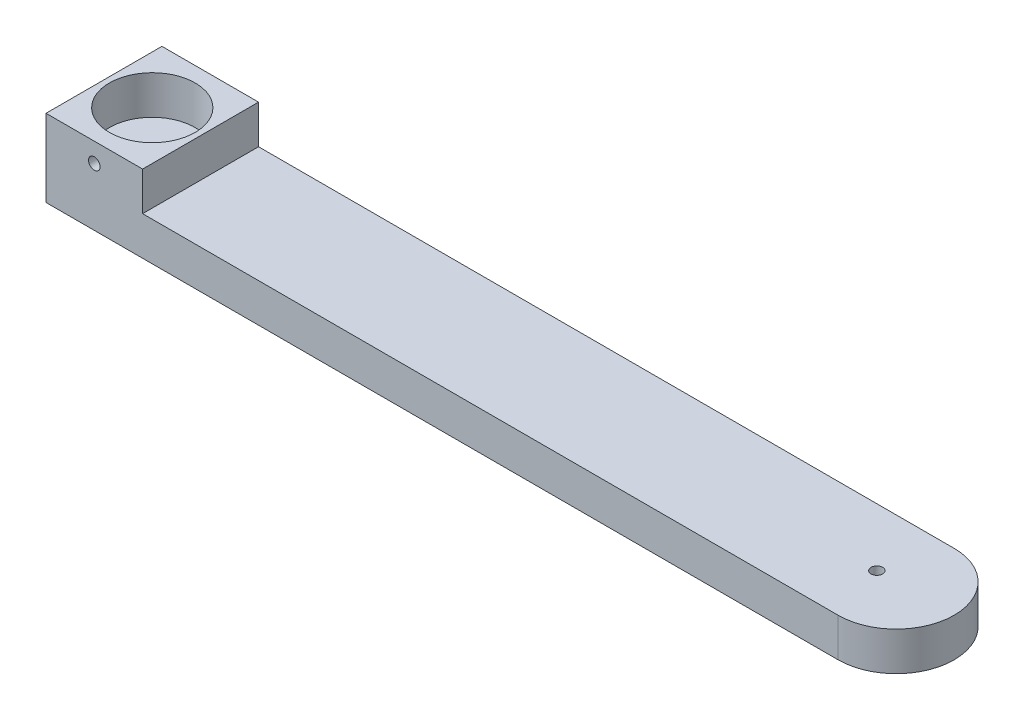
ISO-10303-21;
HEADER;
FILE_DESCRIPTION(('STEP AP214'),'2;1');
FILE_NAME('part.step','',(''),(''),'','','');
FILE_SCHEMA(('AUTOMOTIVE_DESIGN { 1 0 10303 214 1 1 1 1 }'));
ENDSEC;
DATA;
#1=APPLICATION_CONTEXT('core data for automotive mechanical design processes');
#2=APPLICATION_PROTOCOL_DEFINITION('international standard','automotive_design',2000,#1);
#3=PRODUCT_CONTEXT('',#1,'mechanical');
#4=PRODUCT('Part','Part','',(#3));
#5=PRODUCT_RELATED_PRODUCT_CATEGORY('part','',(#4));
#6=PRODUCT_DEFINITION_FORMATION('','',#4);
#7=PRODUCT_DEFINITION_CONTEXT('part definition',#1,'design');
#8=PRODUCT_DEFINITION('design','',#6,#7);
#9=PRODUCT_DEFINITION_SHAPE('','',#8);
#10=(LENGTH_UNIT() NAMED_UNIT(*) SI_UNIT(.MILLI.,.METRE.));
#11=(NAMED_UNIT(*) PLANE_ANGLE_UNIT() SI_UNIT($,.RADIAN.));
#12=(NAMED_UNIT(*) SI_UNIT($,.STERADIAN.) SOLID_ANGLE_UNIT());
#13=UNCERTAINTY_MEASURE_WITH_UNIT(LENGTH_MEASURE(1.E-05),#10,'distance_accuracy_value','');
#14=(GEOMETRIC_REPRESENTATION_CONTEXT(3) GLOBAL_UNCERTAINTY_ASSIGNED_CONTEXT((#13)) GLOBAL_UNIT_ASSIGNED_CONTEXT((#10,
#11,#12)) REPRESENTATION_CONTEXT('',''));
#15=CARTESIAN_POINT('',(0.,0.,0.));
#16=DIRECTION('',(0.,0.,1.));
#17=DIRECTION('',(1.,0.,0.));
#18=AXIS2_PLACEMENT_3D('',#15,#16,#17);
#19=CARTESIAN_POINT('',(0.,10.,15.));
#20=DIRECTION('',(0.,0.,-1.));
#21=DIRECTION('',(-1.,0.,0.));
#22=AXIS2_PLACEMENT_3D('',#19,#20,#21);
#23=PLANE('',#22);
#24=CARTESIAN_POINT('',(-97.5,15.,15.));
#25=DIRECTION('',(0.,0.,1.));
#26=DIRECTION('',(1.,0.,0.));
#27=AXIS2_PLACEMENT_3D('',#24,#25,#26);
#28=CIRCLE('',#27,1.5);
#29=CARTESIAN_POINT('',(-96.,15.,15.));
#30=VERTEX_POINT('',#29);
#31=EDGE_CURVE('E138',#30,#30,#28,.T.);
#32=ORIENTED_EDGE('',*,*,#31,.F.);
#33=EDGE_LOOP('',(#32));
#34=FACE_BOUND('',#33,.T.);
#35=DIRECTION('',(1.,0.,0.));
#36=VECTOR('',#35,1.);
#37=CARTESIAN_POINT('',(0.,0.,15.));
#38=LINE('',#37,#36);
#39=CARTESIAN_POINT('',(-110.,0.,15.));
#40=VERTEX_POINT('',#39);
#41=CARTESIAN_POINT('',(95.,0.,15.));
#42=VERTEX_POINT('',#41);
#43=EDGE_CURVE('E91',#40,#42,#38,.T.);
#44=ORIENTED_EDGE('',*,*,#43,.T.);
#45=DIRECTION('',(0.,-1.,0.));
#46=VECTOR('',#45,1.);
#47=CARTESIAN_POINT('',(95.,10.,15.));
#48=LINE('',#47,#46);
#49=CARTESIAN_POINT('',(95.,10.,15.));
#50=VERTEX_POINT('',#49);
#51=EDGE_CURVE('E11',#50,#42,#48,.T.);
#52=ORIENTED_EDGE('',*,*,#51,.F.);
#53=DIRECTION('',(1.,0.,0.));
#54=VECTOR('',#53,1.);
#55=CARTESIAN_POINT('',(0.,10.,15.));
#56=LINE('',#55,#54);
#57=CARTESIAN_POINT('',(-85.,10.,15.));
#58=VERTEX_POINT('',#57);
#59=EDGE_CURVE('E116',#58,#50,#56,.T.);
#60=ORIENTED_EDGE('',*,*,#59,.F.);
#61=DIRECTION('',(0.,-1.,0.));
#62=VECTOR('',#61,1.);
#63=CARTESIAN_POINT('',(-85.,20.,15.));
#64=LINE('',#63,#62);
#65=CARTESIAN_POINT('',(-85.,20.,15.));
#66=VERTEX_POINT('',#65);
#67=EDGE_CURVE('E110',#66,#58,#64,.T.);
#68=ORIENTED_EDGE('',*,*,#67,.F.);
#69=DIRECTION('',(1.,0.,0.));
#70=VECTOR('',#69,1.);
#71=CARTESIAN_POINT('',(0.,20.,15.));
#72=LINE('',#71,#70);
#73=CARTESIAN_POINT('',(-110.,20.,15.));
#74=VERTEX_POINT('',#73);
#75=EDGE_CURVE('E94',#74,#66,#72,.T.);
#76=ORIENTED_EDGE('',*,*,#75,.F.);
#77=DIRECTION('',(0.,-1.,0.));
#78=VECTOR('',#77,1.);
#79=CARTESIAN_POINT('',(-110.,10.,15.));
#80=LINE('',#79,#78);
#81=EDGE_CURVE('E88',#74,#40,#80,.T.);
#82=ORIENTED_EDGE('',*,*,#81,.T.);
#83=EDGE_LOOP('',(#44,#52,#60,#68,#76,#82));
#84=FACE_BOUND('',#83,.T.);
#85=ADVANCED_FACE('F44',(#34,#84),#23,.F.);
#86=CARTESIAN_POINT('',(95.,10.,0.));
#87=DIRECTION('',(0.,-1.,0.));
#88=DIRECTION('',(0.,0.,-1.));
#89=AXIS2_PLACEMENT_3D('',#86,#87,#88);
#90=CYLINDRICAL_SURFACE('',#89,15.);
#91=CARTESIAN_POINT('',(95.,0.,0.));
#92=DIRECTION('',(0.,1.,0.));
#93=DIRECTION('',(0.,0.,1.));
#94=AXIS2_PLACEMENT_3D('',#91,#92,#93);
#95=CIRCLE('',#94,15.);
#96=CARTESIAN_POINT('',(95.,0.,-15.));
#97=VERTEX_POINT('',#96);
#98=EDGE_CURVE('E108',#42,#97,#95,.T.);
#99=ORIENTED_EDGE('',*,*,#98,.T.);
#100=DIRECTION('',(0.,-1.,0.));
#101=VECTOR('',#100,1.);
#102=CARTESIAN_POINT('',(95.,10.,-15.));
#103=LINE('',#102,#101);
#104=CARTESIAN_POINT('',(95.,10.,-15.));
#105=VERTEX_POINT('',#104);
#106=EDGE_CURVE('E53',#105,#97,#103,.T.);
#107=ORIENTED_EDGE('',*,*,#106,.F.);
#108=CARTESIAN_POINT('',(95.,10.,0.));
#109=DIRECTION('',(0.,1.,0.));
#110=DIRECTION('',(0.,0.,1.));
#111=AXIS2_PLACEMENT_3D('',#108,#109,#110);
#112=CIRCLE('',#111,15.);
#113=EDGE_CURVE('E121',#50,#105,#112,.T.);
#114=ORIENTED_EDGE('',*,*,#113,.F.);
#115=ORIENTED_EDGE('',*,*,#51,.T.);
#116=EDGE_LOOP('',(#99,#107,#114,#115));
#117=FACE_BOUND('',#116,.T.);
#118=ADVANCED_FACE('F167',(#117),#90,.T.);
#119=CARTESIAN_POINT('',(0.,10.,-15.));
#120=DIRECTION('',(0.,0.,-1.));
#121=DIRECTION('',(-1.,0.,0.));
#122=AXIS2_PLACEMENT_3D('',#119,#120,#121);
#123=PLANE('',#122);
#124=CARTESIAN_POINT('',(90.,3.,-15.));
#125=DIRECTION('',(0.,0.,-1.));
#126=DIRECTION('',(-1.,0.,0.));
#127=AXIS2_PLACEMENT_3D('',#124,#125,#126);
#128=CIRCLE('',#127,1.5);
#129=CARTESIAN_POINT('',(88.5,3.,-15.));
#130=VERTEX_POINT('',#129);
#131=EDGE_CURVE('E408',#130,#130,#128,.T.);
#132=ORIENTED_EDGE('',*,*,#131,.F.);
#133=EDGE_LOOP('',(#132));
#134=FACE_BOUND('',#133,.T.);
#135=DIRECTION('',(1.,0.,0.));
#136=VECTOR('',#135,1.);
#137=CARTESIAN_POINT('',(0.,0.,-15.));
#138=LINE('',#137,#136);
#139=CARTESIAN_POINT('',(-110.,0.,-15.));
#140=VERTEX_POINT('',#139);
#141=EDGE_CURVE('E117',#140,#97,#138,.T.);
#142=ORIENTED_EDGE('',*,*,#141,.F.);
#143=DIRECTION('',(0.,-1.,0.));
#144=VECTOR('',#143,1.);
#145=CARTESIAN_POINT('',(-110.,10.,-15.));
#146=LINE('',#145,#144);
#147=CARTESIAN_POINT('',(-110.,20.,-15.));
#148=VERTEX_POINT('',#147);
#149=EDGE_CURVE('E100',#148,#140,#146,.T.);
#150=ORIENTED_EDGE('',*,*,#149,.F.);
#151=DIRECTION('',(-1.,0.,0.));
#152=VECTOR('',#151,1.);
#153=CARTESIAN_POINT('',(0.,20.,-15.));
#154=LINE('',#153,#152);
#155=CARTESIAN_POINT('',(-85.,20.,-15.));
#156=VERTEX_POINT('',#155);
#157=EDGE_CURVE('E196',#156,#148,#154,.T.);
#158=ORIENTED_EDGE('',*,*,#157,.F.);
#159=DIRECTION('',(0.,-1.,0.));
#160=VECTOR('',#159,1.);
#161=CARTESIAN_POINT('',(-85.,20.,-15.));
#162=LINE('',#161,#160);
#163=CARTESIAN_POINT('',(-85.,10.,-15.));
#164=VERTEX_POINT('',#163);
#165=EDGE_CURVE('E203',#156,#164,#162,.T.);
#166=ORIENTED_EDGE('',*,*,#165,.T.);
#167=DIRECTION('',(1.,0.,0.));
#168=VECTOR('',#167,1.);
#169=CARTESIAN_POINT('',(0.,10.,-15.));
#170=LINE('',#169,#168);
#171=EDGE_CURVE('E69',#164,#105,#170,.T.);
#172=ORIENTED_EDGE('',*,*,#171,.T.);
#173=ORIENTED_EDGE('',*,*,#106,.T.);
#174=EDGE_LOOP('',(#142,#150,#158,#166,#172,#173));
#175=FACE_BOUND('',#174,.T.);
#176=ADVANCED_FACE('F172',(#134,#175),#123,.T.);
#177=CARTESIAN_POINT('',(-110.,10.,0.));
#178=DIRECTION('',(-1.,0.,0.));
#179=DIRECTION('',(0.,0.,1.));
#180=AXIS2_PLACEMENT_3D('',#177,#178,#179);
#181=PLANE('',#180);
#182=DIRECTION('',(0.,0.,-1.));
#183=VECTOR('',#182,1.);
#184=CARTESIAN_POINT('',(-110.,0.,0.));
#185=LINE('',#184,#183);
#186=EDGE_CURVE('E106',#40,#140,#185,.T.);
#187=ORIENTED_EDGE('',*,*,#186,.F.);
#188=ORIENTED_EDGE('',*,*,#81,.F.);
#189=DIRECTION('',(0.,0.,1.));
#190=VECTOR('',#189,1.);
#191=CARTESIAN_POINT('',(-110.,20.,0.));
#192=LINE('',#191,#190);
#193=EDGE_CURVE('E200',#148,#74,#192,.T.);
#194=ORIENTED_EDGE('',*,*,#193,.F.);
#195=ORIENTED_EDGE('',*,*,#149,.T.);
#196=EDGE_LOOP('',(#187,#188,#194,#195));
#197=FACE_BOUND('',#196,.T.);
#198=ADVANCED_FACE('F112',(#197),#181,.T.);
#199=CARTESIAN_POINT('',(0.,10.,0.));
#200=DIRECTION('',(0.,1.,0.));
#201=DIRECTION('',(0.,0.,1.));
#202=AXIS2_PLACEMENT_3D('',#199,#200,#201);
#203=PLANE('',#202);
#204=CARTESIAN_POINT('',(90.,10.,0.));
#205=DIRECTION('',(0.,1.,0.));
#206=DIRECTION('',(0.,0.,1.));
#207=AXIS2_PLACEMENT_3D('',#204,#205,#206);
#208=CIRCLE('',#207,1.5);
#209=CARTESIAN_POINT('',(90.,10.,1.5));
#210=VERTEX_POINT('',#209);
#211=EDGE_CURVE('E47',#210,#210,#208,.T.);
#212=ORIENTED_EDGE('',*,*,#211,.F.);
#213=EDGE_LOOP('',(#212));
#214=FACE_BOUND('',#213,.T.);
#215=DIRECTION('',(0.,0.,-1.));
#216=VECTOR('',#215,1.);
#217=CARTESIAN_POINT('',(-85.,10.,0.));
#218=LINE('',#217,#216);
#219=EDGE_CURVE('E61',#58,#164,#218,.T.);
#220=ORIENTED_EDGE('',*,*,#219,.F.);
#221=ORIENTED_EDGE('',*,*,#59,.T.);
#222=ORIENTED_EDGE('',*,*,#113,.T.);
#223=ORIENTED_EDGE('',*,*,#171,.F.);
#224=EDGE_LOOP('',(#220,#221,#222,#223));
#225=FACE_BOUND('',#224,.T.);
#226=ADVANCED_FACE('F163',(#214,#225),#203,.T.);
#227=CARTESIAN_POINT('',(0.,0.,0.));
#228=DIRECTION('',(0.,1.,0.));
#229=DIRECTION('',(0.,0.,1.));
#230=AXIS2_PLACEMENT_3D('',#227,#228,#229);
#231=PLANE('',#230);
#232=CARTESIAN_POINT('',(90.,0.,0.));
#233=DIRECTION('',(0.,1.,0.));
#234=DIRECTION('',(0.,0.,1.));
#235=AXIS2_PLACEMENT_3D('',#232,#233,#234);
#236=CIRCLE('',#235,4.00000000000001);
#237=CARTESIAN_POINT('',(90.,0.,4.00000000000001));
#238=VERTEX_POINT('',#237);
#239=EDGE_CURVE('E182',#238,#238,#236,.T.);
#240=ORIENTED_EDGE('',*,*,#239,.T.);
#241=EDGE_LOOP('',(#240));
#242=FACE_BOUND('',#241,.T.);
#243=ORIENTED_EDGE('',*,*,#43,.F.);
#244=ORIENTED_EDGE('',*,*,#186,.T.);
#245=ORIENTED_EDGE('',*,*,#141,.T.);
#246=ORIENTED_EDGE('',*,*,#98,.F.);
#247=EDGE_LOOP('',(#243,#244,#245,#246));
#248=FACE_BOUND('',#247,.T.);
#249=ADVANCED_FACE('F104',(#242,#248),#231,.F.);
#250=CARTESIAN_POINT('',(-85.,20.,0.));
#251=DIRECTION('',(-1.,0.,0.));
#252=DIRECTION('',(0.,0.,1.));
#253=AXIS2_PLACEMENT_3D('',#250,#251,#252);
#254=PLANE('',#253);
#255=ORIENTED_EDGE('',*,*,#219,.T.);
#256=ORIENTED_EDGE('',*,*,#165,.F.);
#257=DIRECTION('',(0.,0.,-1.));
#258=VECTOR('',#257,1.);
#259=CARTESIAN_POINT('',(-85.,20.,0.));
#260=LINE('',#259,#258);
#261=EDGE_CURVE('E192',#66,#156,#260,.T.);
#262=ORIENTED_EDGE('',*,*,#261,.F.);
#263=ORIENTED_EDGE('',*,*,#67,.T.);
#264=EDGE_LOOP('',(#255,#256,#262,#263));
#265=FACE_BOUND('',#264,.T.);
#266=ADVANCED_FACE('F155',(#265),#254,.F.);
#267=CARTESIAN_POINT('',(-97.5,20.,0.));
#268=DIRECTION('',(0.,-1.,0.));
#269=DIRECTION('',(0.,0.,-1.));
#270=AXIS2_PLACEMENT_3D('',#267,#268,#269);
#271=CYLINDRICAL_SURFACE('',#270,11.1);
#272=CARTESIAN_POINT('',(-96.,15.,10.998181667894));
#273=CARTESIAN_POINT('',(-96.0000035281599,14.9161580954853,10.9981829557639));
#274=CARTESIAN_POINT('',(-96.00705320464,14.8322652184173,10.9991507505894));
#275=CARTESIAN_POINT('',(-96.0350619505974,14.6668183546661,11.0029154546431));
#276=CARTESIAN_POINT('',(-96.0560351833152,14.5852668378615,11.0057142263249));
#277=CARTESIAN_POINT('',(-96.1112578524538,14.4269218129182,11.0128182238988));
#278=CARTESIAN_POINT('',(-96.1454978267286,14.3501249588183,11.0171223759064));
#279=CARTESIAN_POINT('',(-96.2262609525471,14.203379937368,11.0267508792424));
#280=CARTESIAN_POINT('',(-96.2727821618724,14.1334306894973,11.0320750692203));
#281=CARTESIAN_POINT('',(-96.3771116535308,14.0018974483291,11.0431825945482));
#282=CARTESIAN_POINT('',(-96.4349841207836,13.9403645699134,11.0489684243663));
#283=CARTESIAN_POINT('',(-96.5602349623021,13.8278528521415,11.0603249492234));
#284=CARTESIAN_POINT('',(-96.6276138278358,13.7768745585574,11.0658956331254));
#285=CARTESIAN_POINT('',(-96.7702886995094,13.6867335573127,11.0762199772553));
#286=CARTESIAN_POINT('',(-96.845614401394,13.6476174476807,11.0809703845469));
#287=CARTESIAN_POINT('',(-97.0018409378437,13.5826098531584,11.0890914287869));
#288=CARTESIAN_POINT('',(-97.0827415318133,13.556717797963,11.0924621252358));
#289=CARTESIAN_POINT('',(-97.2472969605793,13.5190469436924,11.0974263799507));
#290=CARTESIAN_POINT('',(-97.3309319485008,13.5071828855879,11.0990306698954));
#291=CARTESIAN_POINT('',(-97.4990200643834,13.4976403780351,11.1003180521346));
#292=CARTESIAN_POINT('',(-97.5834731548711,13.4999612818767,11.1000012320149));
#293=CARTESIAN_POINT('',(-97.7502194700646,13.5186548909547,11.0974907319258));
#294=CARTESIAN_POINT('',(-97.8325231861168,13.5349358910085,11.0953093010515));
#295=CARTESIAN_POINT('',(-97.9932194636933,13.5809439526343,11.0893283808514));
#296=CARTESIAN_POINT('',(-98.0716119404195,13.6106713055909,11.0855288564615));
#297=CARTESIAN_POINT('',(-98.2225419342175,13.6828243403859,11.0767175514228));
#298=CARTESIAN_POINT('',(-98.2950604507584,13.7252892923651,11.0717020311502));
#299=CARTESIAN_POINT('',(-98.4319767529992,13.8216834968355,11.0610190509994));
#300=CARTESIAN_POINT('',(-98.4963741035188,13.8756133632692,11.0553515562157));
#301=CARTESIAN_POINT('',(-98.615759546307,13.9939191093961,11.0439446270947));
#302=CARTESIAN_POINT('',(-98.6706683908303,14.0583749700319,11.0382049796966));
#303=CARTESIAN_POINT('',(-98.7689011299827,14.1956294534787,11.0273451054238));
#304=CARTESIAN_POINT('',(-98.8122249763433,14.2684281110479,11.02222488113));
#305=CARTESIAN_POINT('',(-98.8860647988207,14.420376903148,11.0131837217841));
#306=CARTESIAN_POINT('',(-98.9165737389806,14.4995304984919,11.009263445877));
#307=CARTESIAN_POINT('',(-98.9638438279769,14.6619024856602,11.0030784252757));
#308=CARTESIAN_POINT('',(-98.9806057557322,14.7451206468991,11.0008135867836));
#309=CARTESIAN_POINT('',(-98.999799630811,14.9125576158437,10.9982132942663));
#310=CARTESIAN_POINT('',(-99.0023434153572,14.9967633780098,10.9978627830068));
#311=CARTESIAN_POINT('',(-98.993324522813,15.1643999063732,10.9990909519926));
#312=CARTESIAN_POINT('',(-98.9817621986154,15.2478306919057,11.0006695839765));
#313=CARTESIAN_POINT('',(-98.9449537334048,15.4112094889582,11.0055643940137));
#314=CARTESIAN_POINT('',(-98.9197623453649,15.4911700624814,11.0088736178777));
#315=CARTESIAN_POINT('',(-98.8564674313617,15.6457328475667,11.0168510747456));
#316=CARTESIAN_POINT('',(-98.8183633800202,15.7203348409544,11.0215193630447));
#317=CARTESIAN_POINT('',(-98.7300522149472,15.8625669940025,11.0317247959998));
#318=CARTESIAN_POINT('',(-98.6797721230824,15.9301514650908,11.0372671065441));
#319=CARTESIAN_POINT('',(-98.5686386459444,16.0559625834419,11.0485801494988));
#320=CARTESIAN_POINT('',(-98.5077847783193,16.114188803569,11.0543508923205));
#321=CARTESIAN_POINT('',(-98.3767410774895,16.2200268263599,11.0655171538427));
#322=CARTESIAN_POINT('',(-98.3064914240536,16.2675648973252,11.0709098994401));
#323=CARTESIAN_POINT('',(-98.1589391187212,16.3501656702328,11.0806704804548));
#324=CARTESIAN_POINT('',(-98.0816366291609,16.3852286592247,11.0850383394537));
#325=CARTESIAN_POINT('',(-97.9224122795111,16.4417637106836,11.0922447647335));
#326=CARTESIAN_POINT('',(-97.8405054556353,16.4632774979969,11.0950880219759));
#327=CARTESIAN_POINT('',(-97.6742008861326,16.4922389343433,11.0989444503484));
#328=CARTESIAN_POINT('',(-97.5898032730239,16.4996873303363,11.0999577186621));
#329=CARTESIAN_POINT('',(-97.4216309126785,16.5002909534762,11.1000393464978));
#330=CARTESIAN_POINT('',(-97.3378565573709,16.4935595289681,11.099123129641));
#331=CARTESIAN_POINT('',(-97.1726418600208,16.4662357681133,11.0954795521128));
#332=CARTESIAN_POINT('',(-97.0912015143163,16.4456434535153,11.0927521942833));
#333=CARTESIAN_POINT('',(-96.9329877933391,16.3912198660331,11.0857913442088));
#334=CARTESIAN_POINT('',(-96.8562121926061,16.3573949643775,11.0815585768776));
#335=CARTESIAN_POINT('',(-96.7094086804934,16.2774781863336,11.0720541425741));
#336=CARTESIAN_POINT('',(-96.639380903607,16.2313860655117,11.066782454901));
#337=CARTESIAN_POINT('',(-96.5074832394166,16.1278273423753,11.0557374707626));
#338=CARTESIAN_POINT('',(-96.445679699037,16.0702766067003,11.0499606527628));
#339=CARTESIAN_POINT('',(-96.3325644059135,15.9456104791326,11.0385839065207));
#340=CARTESIAN_POINT('',(-96.2812551309311,15.878492834766,11.0329840203164));
#341=CARTESIAN_POINT('',(-96.1903821963188,15.7362462648112,11.0225681672471));
#342=CARTESIAN_POINT('',(-96.1508726383863,15.6610825217623,11.0177558555934));
#343=CARTESIAN_POINT('',(-96.0850947827047,15.5051609892807,11.0095028013328));
#344=CARTESIAN_POINT('',(-96.0588123356939,15.4244092830578,11.0060605939305));
#345=CARTESIAN_POINT('',(-96.0264022342943,15.2860499711023,11.0017578570314));
#346=CARTESIAN_POINT('',(-96.0165159783237,15.2293085746893,11.0004236282957));
#347=CARTESIAN_POINT('',(-96.0033136816685,15.1150527828111,10.9986350959815));
#348=CARTESIAN_POINT('',(-95.9999975787208,15.0575383946764,10.9981807840643));
#349=CARTESIAN_POINT('',(-96.,15.,10.998181667894));
#350=B_SPLINE_CURVE_WITH_KNOTS('',3,(#272,#273,#274,#275,#276,#277,#278,#279,#280,#281,#282,
#283,#284,#285,#286,#287,#288,#289,#290,#291,#292,#293,#294,#295,#296,#297,#298,#299,#300,#301,
#302,#303,#304,#305,#306,#307,#308,#309,#310,#311,#312,#313,#314,#315,#316,#317,#318,#319,#320,
#321,#322,#323,#324,#325,#326,#327,#328,#329,#330,#331,#332,#333,#334,#335,#336,#337,#338,#339,
#340,#341,#342,#343,#344,#345,#346,#347,#348,#349),.UNSPECIFIED.,.T.,.F.,(4,2,2,2,2,2,2,2,2,2,2,
2,2,2,2,2,2,2,2,2,2,2,2,2,2,2,2,2,2,2,2,2,2,2,2,2,2,2,4),(0.,0.251315475026076,
0.502886984255115,0.754279396186547,1.00563207540844,1.25844926325154,1.51127952087323,
1.76509047225189,2.01889047677066,2.27113988027382,2.52337778350097,2.77397129666125,
3.02457024048255,3.27594986605267,3.52734295631578,3.78074363304597,4.03414536554633,
4.28768604564961,4.54121235890301,4.79274164545196,5.04426463961617,5.29478459618081,
5.5453147468855,5.79738534556772,6.04946744616716,6.30323852618945,6.55700376660183,
6.80998366435175,7.0629501269153,7.31390214366,7.56485376664346,7.81568470980397,
8.06652065133149,8.31927116234464,8.57208128061707,8.82603333960263,9.07971316131319,
9.2521856988985,9.42465660201113),.UNSPECIFIED.);
#351=CARTESIAN_POINT('',(-96.,15.,10.998181667894));
#352=VERTEX_POINT('',#351);
#353=EDGE_CURVE('E129',#352,#352,#350,.T.);
#354=ORIENTED_EDGE('',*,*,#353,.F.);
#355=EDGE_LOOP('',(#354));
#356=FACE_BOUND('',#355,.T.);
#357=CARTESIAN_POINT('',(-97.5,20.,0.));
#358=DIRECTION('',(0.,1.,0.));
#359=DIRECTION('',(0.,0.,1.));
#360=AXIS2_PLACEMENT_3D('',#357,#358,#359);
#361=CIRCLE('',#360,11.1);
#362=CARTESIAN_POINT('',(-97.5,20.,11.1));
#363=VERTEX_POINT('',#362);
#364=EDGE_CURVE('E186',#363,#363,#361,.T.);
#365=ORIENTED_EDGE('',*,*,#364,.T.);
#366=EDGE_LOOP('',(#365));
#367=FACE_BOUND('',#366,.T.);
#368=CARTESIAN_POINT('',(-97.5,10.,0.));
#369=DIRECTION('',(0.,1.,0.));
#370=DIRECTION('',(0.,0.,1.));
#371=AXIS2_PLACEMENT_3D('',#368,#369,#370);
#372=CIRCLE('',#371,11.1);
#373=CARTESIAN_POINT('',(-97.5,10.,11.1));
#374=VERTEX_POINT('',#373);
#375=EDGE_CURVE('E137',#374,#374,#372,.T.);
#376=ORIENTED_EDGE('',*,*,#375,.F.);
#377=EDGE_LOOP('',(#376));
#378=FACE_BOUND('',#377,.T.);
#379=ADVANCED_FACE('F139',(#356,#367,#378),#271,.F.);
#380=CARTESIAN_POINT('',(0.,20.,0.));
#381=DIRECTION('',(0.,1.,0.));
#382=DIRECTION('',(0.,0.,1.));
#383=AXIS2_PLACEMENT_3D('',#380,#381,#382);
#384=PLANE('',#383);
#385=ORIENTED_EDGE('',*,*,#364,.F.);
#386=EDGE_LOOP('',(#385));
#387=FACE_BOUND('',#386,.T.);
#388=ORIENTED_EDGE('',*,*,#75,.T.);
#389=ORIENTED_EDGE('',*,*,#261,.T.);
#390=ORIENTED_EDGE('',*,*,#157,.T.);
#391=ORIENTED_EDGE('',*,*,#193,.T.);
#392=EDGE_LOOP('',(#388,#389,#390,#391));
#393=FACE_BOUND('',#392,.T.);
#394=ADVANCED_FACE('F152',(#387,#393),#384,.T.);
#395=ORIENTED_EDGE('',*,*,#375,.T.);
#396=EDGE_LOOP('',(#395));
#397=FACE_BOUND('',#396,.T.);
#398=ADVANCED_FACE('F149',(#397),#203,.T.);
#399=CARTESIAN_POINT('',(-97.5,15.,5.));
#400=DIRECTION('',(0.,0.,1.));
#401=DIRECTION('',(1.,0.,0.));
#402=AXIS2_PLACEMENT_3D('',#399,#400,#401);
#403=CYLINDRICAL_SURFACE('',#402,1.5);
#404=ORIENTED_EDGE('',*,*,#353,.T.);
#405=EDGE_LOOP('',(#404));
#406=FACE_BOUND('',#405,.T.);
#407=ORIENTED_EDGE('',*,*,#31,.T.);
#408=EDGE_LOOP('',(#407));
#409=FACE_BOUND('',#408,.T.);
#410=ADVANCED_FACE('F143',(#406,#409),#403,.F.);
#411=CARTESIAN_POINT('',(90.,6.5,0.));
#412=DIRECTION('',(0.,-1.,0.));
#413=DIRECTION('',(0.,0.,-1.));
#414=AXIS2_PLACEMENT_3D('',#411,#412,#413);
#415=CYLINDRICAL_SURFACE('',#414,4.00000000000001);
#416=CARTESIAN_POINT('',(88.5,3.,-3.70809924354784));
#417=CARTESIAN_POINT('',(88.4999969589389,3.08100748372079,-3.70809640633807));
#418=CARTESIAN_POINT('',(88.5065840245051,3.16199492250364,-3.71078260240987));
#419=CARTESIAN_POINT('',(88.5326381210454,3.3215280829132,-3.72116159304968));
#420=CARTESIAN_POINT('',(88.5521047662674,3.40007387759501,-3.72885423767113));
#421=CARTESIAN_POINT('',(88.6031034238943,3.55237537161353,-3.74825480280901));
#422=CARTESIAN_POINT('',(88.6346065273365,3.62614205665109,-3.75995309569261));
#423=CARTESIAN_POINT('',(88.708681432573,3.76737189681885,-3.78603134206599));
#424=CARTESIAN_POINT('',(88.7512565590496,3.83483315028252,-3.80041210067324));
#425=CARTESIAN_POINT('',(88.8485333862584,3.96489031162282,-3.83103574665714));
#426=CARTESIAN_POINT('',(88.903696187867,4.0271285296294,-3.84733341923604));
#427=CARTESIAN_POINT('',(89.0236041602211,4.14172281467149,-3.87949750628548));
#428=CARTESIAN_POINT('',(89.0883513697434,4.19407677374186,-3.89536382814786));
#429=CARTESIAN_POINT('',(89.2283053448224,4.28913951229561,-3.92552873936554));
#430=CARTESIAN_POINT('',(89.303793052462,4.33145947471586,-3.93975561223506));
#431=CARTESIAN_POINT('',(89.4614442280348,4.40265117252491,-3.96438007973848));
#432=CARTESIAN_POINT('',(89.5436053690665,4.43152757199197,-3.97477900217007));
#433=CARTESIAN_POINT('',(89.7085106583232,4.47375789577462,-3.9901869710344));
#434=CARTESIAN_POINT('',(89.7910768027185,4.48772762744046,-3.99540915214775));
#435=CARTESIAN_POINT('',(89.9575356362053,4.50172120094499,-4.00064014107941));
#436=CARTESIAN_POINT('',(90.0414278850629,4.50174957761871,-4.00065064414903));
#437=CARTESIAN_POINT('',(90.2037435430645,4.48821823853482,-3.99559265903895));
#438=CARTESIAN_POINT('',(90.2822321782669,4.47533070205118,-3.99077541996684));
#439=CARTESIAN_POINT('',(90.4358392179844,4.43746408477444,-3.97693274932263));
#440=CARTESIAN_POINT('',(90.5109573834303,4.41248414773796,-3.96790701975578));
#441=CARTESIAN_POINT('',(90.6569890173031,4.35082954832415,-3.94637769167531));
#442=CARTESIAN_POINT('',(90.7278253922873,4.31398999473159,-3.93382539470078));
#443=CARTESIAN_POINT('',(90.8624866079576,4.22980790307061,-3.9065131022528));
#444=CARTESIAN_POINT('',(90.9263091769323,4.18246197698239,-3.89175239512841));
#445=CARTESIAN_POINT('',(91.049090486801,4.07537271371681,-3.86052529655817));
#446=CARTESIAN_POINT('',(91.1075461452635,4.01506608434958,-3.84400963763883));
#447=CARTESIAN_POINT('',(91.2137039556934,3.88540700667844,-3.81182460645723));
#448=CARTESIAN_POINT('',(91.261403406929,3.81605229341336,-3.79615544748848));
#449=CARTESIAN_POINT('',(91.3456561180815,3.66828053253718,-3.76712703500336));
#450=CARTESIAN_POINT('',(91.3819384785183,3.58969650631394,-3.75382677150277));
#451=CARTESIAN_POINT('',(91.440564644415,3.42690377483243,-3.73172438629003));
#452=CARTESIAN_POINT('',(91.462916206056,3.34269822840631,-3.72291976205784));
#453=CARTESIAN_POINT('',(91.4919019170967,3.17602403768405,-3.71139597222849));
#454=CARTESIAN_POINT('',(91.4993352115897,3.09371589446386,-3.70836785241538));
#455=CARTESIAN_POINT('',(91.5005788563628,2.92899064325826,-3.70786539525017));
#456=CARTESIAN_POINT('',(91.4943926109376,2.84657356764753,-3.71038967003987));
#457=CARTESIAN_POINT('',(91.4692973352016,2.68807007771232,-3.72039381629736));
#458=CARTESIAN_POINT('',(91.4510061833423,2.61186886423534,-3.72763276216449));
#459=CARTESIAN_POINT('',(91.4029977464064,2.46365205527981,-3.74596487046362));
#460=CARTESIAN_POINT('',(91.3732781203462,2.39163732083186,-3.75705882250173));
#461=CARTESIAN_POINT('',(91.3020029227528,2.25083556192379,-3.7823624311608));
#462=CARTESIAN_POINT('',(91.2600454517705,2.18227070786266,-3.79667328892066));
#463=CARTESIAN_POINT('',(91.1659131786248,2.05287101827396,-3.82662814294292));
#464=CARTESIAN_POINT('',(91.1137346369644,1.99203902537536,-3.84227262594078));
#465=CARTESIAN_POINT('',(90.996727340901,1.8758316268049,-3.87433046553185));
#466=CARTESIAN_POINT('',(90.9313063414911,1.82104659123124,-3.89072969357028));
#467=CARTESIAN_POINT('',(90.7917974717532,1.72316163241056,-3.92149874963303));
#468=CARTESIAN_POINT('',(90.7177095733227,1.68006174705416,-3.93586857107665));
#469=CARTESIAN_POINT('',(90.5630163294685,1.60705394380039,-3.96094985704552));
#470=CARTESIAN_POINT('',(90.4824344330646,1.5771008762074,-3.97167381338011));
#471=CARTESIAN_POINT('',(90.3168818875233,1.53134358615008,-3.98829436712572));
#472=CARTESIAN_POINT('',(90.2319133207236,1.5155327145776,-3.99419323299413));
#473=CARTESIAN_POINT('',(90.0653355852738,1.49922559724518,-4.00028407317074));
#474=CARTESIAN_POINT('',(89.9838192319392,1.49789051694101,-4.00078860953765));
#475=CARTESIAN_POINT('',(89.8217732135876,1.5084151594454,-3.99684889809224));
#476=CARTESIAN_POINT('',(89.7412434307548,1.52027329088586,-3.99240524713131));
#477=CARTESIAN_POINT('',(89.5854517516229,1.55625885149362,-3.97921089603772));
#478=CARTESIAN_POINT('',(89.5101092689312,1.58007990587836,-3.97056791378018));
#479=CARTESIAN_POINT('',(89.3644845269936,1.63901001338437,-3.9498778362099));
#480=CARTESIAN_POINT('',(89.2942032287245,1.67412120330476,-3.93783009655664));
#481=CARTESIAN_POINT('',(89.1574598230056,1.75631394350482,-3.91090618300075));
#482=CARTESIAN_POINT('',(89.0912824511532,1.80383664051415,-3.89593240108829));
#483=CARTESIAN_POINT('',(88.9675826524767,1.9088078301876,-3.86499507694845));
#484=CARTESIAN_POINT('',(88.9100633287441,1.96625986580788,-3.84903118274028));
#485=CARTESIAN_POINT('',(88.8021878576381,2.09306413164506,-3.81688129739176));
#486=CARTESIAN_POINT('',(88.7523700018398,2.16288440215432,-3.8007280534916));
#487=CARTESIAN_POINT('',(88.6651529044316,2.31041586957333,-3.77098325003639));
#488=CARTESIAN_POINT('',(88.6277549512184,2.38812788405349,-3.75739195631217));
#489=CARTESIAN_POINT('',(88.5653411302574,2.55295568097541,-3.73402269853267));
#490=CARTESIAN_POINT('',(88.5409399710048,2.64033436651179,-3.7244380329086));
#491=CARTESIAN_POINT('',(88.5082764327792,2.81848527195579,-3.71147994336316));
#492=CARTESIAN_POINT('',(88.5000034066043,2.90925521270999,-3.70810242179737));
#493=CARTESIAN_POINT('',(88.5,3.,-3.70809924354784));
#494=B_SPLINE_CURVE_WITH_KNOTS('',3,(#416,#417,#418,#419,#420,#421,#422,#423,#424,#425,#426,
#427,#428,#429,#430,#431,#432,#433,#434,#435,#436,#437,#438,#439,#440,#441,#442,#443,#444,#445,
#446,#447,#448,#449,#450,#451,#452,#453,#454,#455,#456,#457,#458,#459,#460,#461,#462,#463,#464,
#465,#466,#467,#468,#469,#470,#471,#472,#473,#474,#475,#476,#477,#478,#479,#480,#481,#482,#483,
#484,#485,#486,#487,#488,#489,#490,#491,#492,#493),.UNSPECIFIED.,.T.,.F.,(4,2,2,2,2,2,2,2,2,2,2,
2,2,2,2,2,2,2,2,2,2,2,2,2,2,2,2,2,2,2,2,2,2,2,2,2,2,2,4),(0.,0.242684541416171,
0.485361814598857,0.727459856757036,0.969630679682938,1.22274652401129,1.47591628822983,
1.73770072136421,1.99939426381331,2.2498001848968,2.50012465404857,2.73806472803194,
2.97602165263334,3.21744131210667,3.45893893628975,3.71456675065873,3.97025867827334,
4.23162592252965,4.49284751635473,4.73965657740484,4.98640395388884,5.22143845928198,
5.45652113429526,5.70041561005821,5.94439948466355,6.20385016993623,6.46330169650177,
6.72185508890168,6.98028685560126,7.22365720549934,7.46699820319477,7.70440274003889,
7.94185223512831,8.18928323676985,8.43680270894962,8.69738599542078,8.95799630544242,
9.23003178870925,9.50188762323052),.UNSPECIFIED.);
#495=CARTESIAN_POINT('',(88.5,3.,-3.70809924354784));
#496=VERTEX_POINT('',#495);
#497=EDGE_CURVE('E412',#496,#496,#494,.T.);
#498=ORIENTED_EDGE('',*,*,#497,.T.);
#499=EDGE_LOOP('',(#498));
#500=FACE_BOUND('',#499,.T.);
#501=CARTESIAN_POINT('',(90.,6.5,0.));
#502=DIRECTION('',(0.,1.,0.));
#503=DIRECTION('',(0.,0.,1.));
#504=AXIS2_PLACEMENT_3D('',#501,#502,#503);
#505=CIRCLE('',#504,4.00000000000001);
#506=CARTESIAN_POINT('',(90.,6.5,4.00000000000001));
#507=VERTEX_POINT('',#506);
#508=EDGE_CURVE('E178',#507,#507,#505,.T.);
#509=ORIENTED_EDGE('',*,*,#508,.T.);
#510=EDGE_LOOP('',(#509));
#511=FACE_BOUND('',#510,.T.);
#512=ORIENTED_EDGE('',*,*,#239,.F.);
#513=EDGE_LOOP('',(#512));
#514=FACE_BOUND('',#513,.T.);
#515=ADVANCED_FACE('F148',(#500,#511,#514),#415,.F.);
#516=CARTESIAN_POINT('',(90.,6.5,0.));
#517=DIRECTION('',(0.,1.,0.));
#518=DIRECTION('',(0.,0.,1.));
#519=AXIS2_PLACEMENT_3D('',#516,#517,#518);
#520=PLANE('',#519);
#521=CARTESIAN_POINT('',(90.,6.5,0.));
#522=DIRECTION('',(0.,-1.,0.));
#523=DIRECTION('',(0.,0.,-1.));
#524=AXIS2_PLACEMENT_3D('',#521,#522,#523);
#525=CIRCLE('',#524,1.5);
#526=CARTESIAN_POINT('',(90.,6.5,-1.5));
#527=VERTEX_POINT('',#526);
#528=EDGE_CURVE('E411',#527,#527,#525,.T.);
#529=ORIENTED_EDGE('',*,*,#528,.F.);
#530=EDGE_LOOP('',(#529));
#531=FACE_BOUND('',#530,.T.);
#532=ORIENTED_EDGE('',*,*,#508,.F.);
#533=EDGE_LOOP('',(#532));
#534=FACE_BOUND('',#533,.T.);
#535=ADVANCED_FACE('F259',(#531,#534),#520,.F.);
#536=CARTESIAN_POINT('',(90.,20.5,0.));
#537=DIRECTION('',(0.,-1.,0.));
#538=DIRECTION('',(0.,0.,-1.));
#539=AXIS2_PLACEMENT_3D('',#536,#537,#538);
#540=CYLINDRICAL_SURFACE('',#539,1.5);
#541=ORIENTED_EDGE('',*,*,#211,.T.);
#542=EDGE_LOOP('',(#541));
#543=FACE_BOUND('',#542,.T.);
#544=ORIENTED_EDGE('',*,*,#528,.T.);
#545=EDGE_LOOP('',(#544));
#546=FACE_BOUND('',#545,.T.);
#547=ADVANCED_FACE('F268',(#543,#546),#540,.F.);
#548=CARTESIAN_POINT('',(90.,3.,15.001));
#549=DIRECTION('',(0.,0.,-1.));
#550=DIRECTION('',(-1.,0.,0.));
#551=AXIS2_PLACEMENT_3D('',#548,#549,#550);
#552=CYLINDRICAL_SURFACE('',#551,1.5);
#553=ORIENTED_EDGE('',*,*,#497,.F.);
#554=EDGE_LOOP('',(#553));
#555=FACE_BOUND('',#554,.T.);
#556=ORIENTED_EDGE('',*,*,#131,.T.);
#557=EDGE_LOOP('',(#556));
#558=FACE_BOUND('',#557,.T.);
#559=ADVANCED_FACE('F275',(#555,#558),#552,.F.);
#560=CLOSED_SHELL('',(#85,#118,#176,#198,#226,#249,#266,#379,#394,#398,#410,#515,#535,#547,#559));
#561=MANIFOLD_SOLID_BREP('B2',#560);
#562=ADVANCED_BREP_SHAPE_REPRESENTATION('',(#18,#561),#14);
#563=SHAPE_DEFINITION_REPRESENTATION(#9,#562);
ENDSEC;
END-ISO-10303-21;
